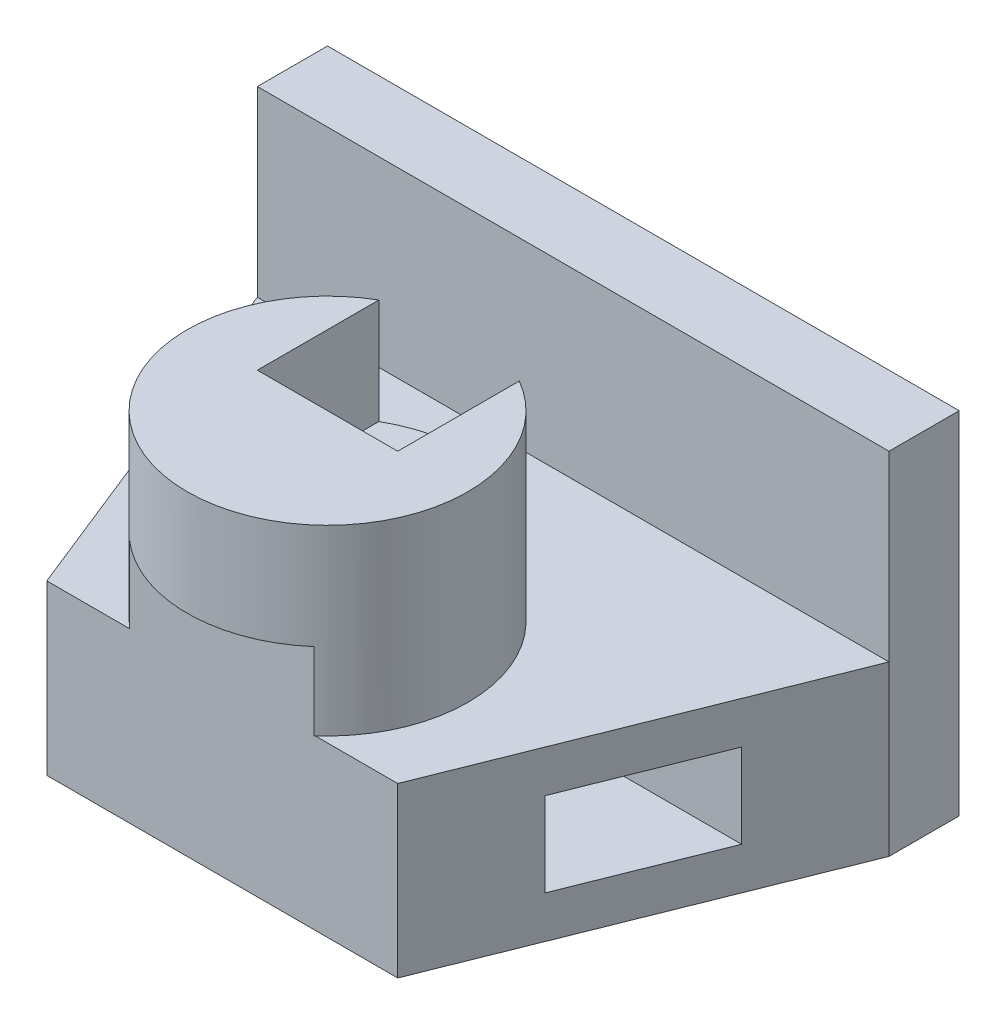
ISO-10303-21;
HEADER;
FILE_DESCRIPTION(('STEP AP214'),'2;1');
FILE_NAME('part.step','',(''),(''),'','','');
FILE_SCHEMA(('AUTOMOTIVE_DESIGN { 1 0 10303 214 1 1 1 1 }'));
ENDSEC;
DATA;
#1=APPLICATION_CONTEXT('core data for automotive mechanical design processes');
#2=APPLICATION_PROTOCOL_DEFINITION('international standard','automotive_design',2000,#1);
#3=PRODUCT_CONTEXT('',#1,'mechanical');
#4=PRODUCT('Part','Part','',(#3));
#5=PRODUCT_RELATED_PRODUCT_CATEGORY('part','',(#4));
#6=PRODUCT_DEFINITION_FORMATION('','',#4);
#7=PRODUCT_DEFINITION_CONTEXT('part definition',#1,'design');
#8=PRODUCT_DEFINITION('design','',#6,#7);
#9=PRODUCT_DEFINITION_SHAPE('','',#8);
#10=(LENGTH_UNIT() NAMED_UNIT(*) SI_UNIT(.MILLI.,.METRE.));
#11=(NAMED_UNIT(*) PLANE_ANGLE_UNIT() SI_UNIT($,.RADIAN.));
#12=(NAMED_UNIT(*) SI_UNIT($,.STERADIAN.) SOLID_ANGLE_UNIT());
#13=UNCERTAINTY_MEASURE_WITH_UNIT(LENGTH_MEASURE(1.E-05),#10,'distance_accuracy_value','');
#14=(GEOMETRIC_REPRESENTATION_CONTEXT(3) GLOBAL_UNCERTAINTY_ASSIGNED_CONTEXT((#13)) GLOBAL_UNIT_ASSIGNED_CONTEXT((#10,
#11,#12)) REPRESENTATION_CONTEXT('',''));
#15=CARTESIAN_POINT('',(0.,0.,0.));
#16=DIRECTION('',(0.,0.,1.));
#17=DIRECTION('',(1.,0.,0.));
#18=AXIS2_PLACEMENT_3D('',#15,#16,#17);
#19=CARTESIAN_POINT('',(45.,-25.,10.));
#20=DIRECTION('',(-1.,0.,0.));
#21=DIRECTION('',(0.,0.,1.));
#22=AXIS2_PLACEMENT_3D('',#19,#20,#21);
#23=PLANE('',#22);
#24=DIRECTION('',(0.,1.,0.));
#25=VECTOR('',#24,1.);
#26=CARTESIAN_POINT('',(45.,-25.,0.));
#27=LINE('',#26,#25);
#28=CARTESIAN_POINT('',(45.,-25.,0.));
#29=VERTEX_POINT('',#28);
#30=CARTESIAN_POINT('',(45.,25.,0.));
#31=VERTEX_POINT('',#30);
#32=EDGE_CURVE('E232',#29,#31,#27,.T.);
#33=ORIENTED_EDGE('',*,*,#32,.T.);
#34=DIRECTION('',(0.,0.,-1.));
#35=VECTOR('',#34,1.);
#36=CARTESIAN_POINT('',(45.,25.,10.));
#37=LINE('',#36,#35);
#38=CARTESIAN_POINT('',(45.,25.,10.));
#39=VERTEX_POINT('',#38);
#40=EDGE_CURVE('E205',#39,#31,#37,.T.);
#41=ORIENTED_EDGE('',*,*,#40,.F.);
#42=DIRECTION('',(0.,1.,0.));
#43=VECTOR('',#42,1.);
#44=CARTESIAN_POINT('',(45.,-25.,10.));
#45=LINE('',#44,#43);
#46=CARTESIAN_POINT('',(45.,-1.,10.));
#47=VERTEX_POINT('',#46);
#48=EDGE_CURVE('E225',#47,#39,#45,.T.);
#49=ORIENTED_EDGE('',*,*,#48,.F.);
#50=CARTESIAN_POINT('',(45.,-25.,10.));
#51=VERTEX_POINT('',#50);
#52=EDGE_CURVE('E243',#51,#47,#45,.T.);
#53=ORIENTED_EDGE('',*,*,#52,.F.);
#54=DIRECTION('',(0.,0.,-1.));
#55=VECTOR('',#54,1.);
#56=CARTESIAN_POINT('',(45.,-25.,10.));
#57=LINE('',#56,#55);
#58=EDGE_CURVE('E217',#51,#29,#57,.T.);
#59=ORIENTED_EDGE('',*,*,#58,.T.);
#60=EDGE_LOOP('',(#33,#41,#49,#53,#59));
#61=FACE_BOUND('',#60,.T.);
#62=ADVANCED_FACE('F39',(#61),#23,.F.);
#63=CARTESIAN_POINT('',(-45.,25.,10.));
#64=DIRECTION('',(0.,-1.,0.));
#65=DIRECTION('',(0.,0.,-1.));
#66=AXIS2_PLACEMENT_3D('',#63,#64,#65);
#67=PLANE('',#66);
#68=DIRECTION('',(-1.,0.,0.));
#69=VECTOR('',#68,1.);
#70=CARTESIAN_POINT('',(-45.,25.,0.));
#71=LINE('',#70,#69);
#72=CARTESIAN_POINT('',(-45.,25.,0.));
#73=VERTEX_POINT('',#72);
#74=EDGE_CURVE('E229',#31,#73,#71,.T.);
#75=ORIENTED_EDGE('',*,*,#74,.T.);
#76=DIRECTION('',(0.,0.,-1.));
#77=VECTOR('',#76,1.);
#78=CARTESIAN_POINT('',(-45.,25.,10.));
#79=LINE('',#78,#77);
#80=CARTESIAN_POINT('',(-45.,25.,10.));
#81=VERTEX_POINT('',#80);
#82=EDGE_CURVE('E209',#81,#73,#79,.T.);
#83=ORIENTED_EDGE('',*,*,#82,.F.);
#84=DIRECTION('',(-1.,0.,0.));
#85=VECTOR('',#84,1.);
#86=CARTESIAN_POINT('',(-45.,25.,10.));
#87=LINE('',#86,#85);
#88=EDGE_CURVE('E240',#39,#81,#87,.T.);
#89=ORIENTED_EDGE('',*,*,#88,.F.);
#90=ORIENTED_EDGE('',*,*,#40,.T.);
#91=EDGE_LOOP('',(#75,#83,#89,#90));
#92=FACE_BOUND('',#91,.T.);
#93=ADVANCED_FACE('F380',(#92),#67,.F.);
#94=CARTESIAN_POINT('',(-45.,-25.,10.));
#95=DIRECTION('',(1.,0.,0.));
#96=DIRECTION('',(0.,0.,-1.));
#97=AXIS2_PLACEMENT_3D('',#94,#95,#96);
#98=PLANE('',#97);
#99=DIRECTION('',(0.,-1.,0.));
#100=VECTOR('',#99,1.);
#101=CARTESIAN_POINT('',(-45.,-25.,0.));
#102=LINE('',#101,#100);
#103=CARTESIAN_POINT('',(-45.,-25.,0.));
#104=VERTEX_POINT('',#103);
#105=EDGE_CURVE('E226',#73,#104,#102,.T.);
#106=ORIENTED_EDGE('',*,*,#105,.T.);
#107=DIRECTION('',(0.,0.,-1.));
#108=VECTOR('',#107,1.);
#109=CARTESIAN_POINT('',(-45.,-25.,10.));
#110=LINE('',#109,#108);
#111=CARTESIAN_POINT('',(-45.,-25.,10.));
#112=VERTEX_POINT('',#111);
#113=EDGE_CURVE('E213',#112,#104,#110,.T.);
#114=ORIENTED_EDGE('',*,*,#113,.F.);
#115=DIRECTION('',(0.,-1.,0.));
#116=VECTOR('',#115,1.);
#117=CARTESIAN_POINT('',(-45.,-1.,10.));
#118=LINE('',#117,#116);
#119=CARTESIAN_POINT('',(-45.,-1.,10.));
#120=VERTEX_POINT('',#119);
#121=EDGE_CURVE('E236',#120,#112,#118,.T.);
#122=ORIENTED_EDGE('',*,*,#121,.F.);
#123=DIRECTION('',(0.,-1.,0.));
#124=VECTOR('',#123,1.);
#125=CARTESIAN_POINT('',(-45.,-25.,10.));
#126=LINE('',#125,#124);
#127=EDGE_CURVE('E221',#81,#120,#126,.T.);
#128=ORIENTED_EDGE('',*,*,#127,.F.);
#129=ORIENTED_EDGE('',*,*,#82,.T.);
#130=EDGE_LOOP('',(#106,#114,#122,#128,#129));
#131=FACE_BOUND('',#130,.T.);
#132=ADVANCED_FACE('F385',(#131),#98,.F.);
#133=CARTESIAN_POINT('',(-45.,-25.,10.));
#134=DIRECTION('',(0.,1.,0.));
#135=DIRECTION('',(0.,0.,1.));
#136=AXIS2_PLACEMENT_3D('',#133,#134,#135);
#137=PLANE('',#136);
#138=DIRECTION('',(1.,0.,0.));
#139=VECTOR('',#138,1.);
#140=CARTESIAN_POINT('',(-45.,-25.,0.));
#141=LINE('',#140,#139);
#142=EDGE_CURVE('E222',#104,#29,#141,.T.);
#143=ORIENTED_EDGE('',*,*,#142,.T.);
#144=ORIENTED_EDGE('',*,*,#58,.F.);
#145=DIRECTION('',(-0.371390676354103,0.,0.92847669088526));
#146=VECTOR('',#145,1.);
#147=CARTESIAN_POINT('',(25.,-25.,60.));
#148=LINE('',#147,#146);
#149=CARTESIAN_POINT('',(25.,-25.,60.));
#150=VERTEX_POINT('',#149);
#151=EDGE_CURVE('E265',#51,#150,#148,.T.);
#152=ORIENTED_EDGE('',*,*,#151,.T.);
#153=DIRECTION('',(-1.,0.,0.));
#154=VECTOR('',#153,1.);
#155=CARTESIAN_POINT('',(-25.,-25.,60.));
#156=LINE('',#155,#154);
#157=CARTESIAN_POINT('',(-25.,-25.,60.));
#158=VERTEX_POINT('',#157);
#159=EDGE_CURVE('E262',#150,#158,#156,.T.);
#160=ORIENTED_EDGE('',*,*,#159,.T.);
#161=DIRECTION('',(-0.371390676354104,0.,-0.928476690885259));
#162=VECTOR('',#161,1.);
#163=CARTESIAN_POINT('',(-45.,-25.,10.));
#164=LINE('',#163,#162);
#165=EDGE_CURVE('E257',#158,#112,#164,.T.);
#166=ORIENTED_EDGE('',*,*,#165,.T.);
#167=ORIENTED_EDGE('',*,*,#113,.T.);
#168=EDGE_LOOP('',(#143,#144,#152,#160,#166,#167));
#169=FACE_BOUND('',#168,.T.);
#170=ADVANCED_FACE('F429',(#169),#137,.F.);
#171=CARTESIAN_POINT('',(0.,0.,10.));
#172=DIRECTION('',(0.,0.,-1.));
#173=DIRECTION('',(-1.,0.,0.));
#174=AXIS2_PLACEMENT_3D('',#171,#172,#173);
#175=PLANE('',#174);
#176=ORIENTED_EDGE('',*,*,#127,.T.);
#177=DIRECTION('',(1.,0.,0.));
#178=VECTOR('',#177,1.);
#179=CARTESIAN_POINT('',(45.,-1.,10.));
#180=LINE('',#179,#178);
#181=EDGE_CURVE('E251',#120,#47,#180,.T.);
#182=ORIENTED_EDGE('',*,*,#181,.T.);
#183=ORIENTED_EDGE('',*,*,#48,.T.);
#184=ORIENTED_EDGE('',*,*,#88,.T.);
#185=EDGE_LOOP('',(#176,#182,#183,#184));
#186=FACE_BOUND('',#185,.T.);
#187=ADVANCED_FACE('F400',(#186),#175,.F.);
#188=CARTESIAN_POINT('',(0.,0.,0.));
#189=DIRECTION('',(0.,0.,-1.));
#190=DIRECTION('',(-1.,0.,0.));
#191=AXIS2_PLACEMENT_3D('',#188,#189,#190);
#192=PLANE('',#191);
#193=ORIENTED_EDGE('',*,*,#32,.F.);
#194=ORIENTED_EDGE('',*,*,#142,.F.);
#195=ORIENTED_EDGE('',*,*,#105,.F.);
#196=ORIENTED_EDGE('',*,*,#74,.F.);
#197=EDGE_LOOP('',(#193,#194,#195,#196));
#198=FACE_BOUND('',#197,.T.);
#199=ADVANCED_FACE('F394',(#198),#192,.T.);
#200=CARTESIAN_POINT('',(25.,-1.,60.));
#201=DIRECTION('',(0.928476690885259,0.,0.371390676354103));
#202=DIRECTION('',(0.371390676354103,0.,-0.92847669088526));
#203=AXIS2_PLACEMENT_3D('',#200,#201,#202);
#204=PLANE('',#203);
#205=DIRECTION('',(0.,-1.,0.));
#206=VECTOR('',#205,1.);
#207=CARTESIAN_POINT('',(31.,-1.,45.));
#208=LINE('',#207,#206);
#209=CARTESIAN_POINT('',(31.,-7.,45.));
#210=VERTEX_POINT('',#209);
#211=CARTESIAN_POINT('',(31.,-19.,45.));
#212=VERTEX_POINT('',#211);
#213=EDGE_CURVE('E177',#210,#212,#208,.T.);
#214=ORIENTED_EDGE('',*,*,#213,.F.);
#215=DIRECTION('',(-0.371390676354103,0.,0.92847669088526));
#216=VECTOR('',#215,1.);
#217=CARTESIAN_POINT('',(25.,-7.,60.));
#218=LINE('',#217,#216);
#219=CARTESIAN_POINT('',(39.,-7.,25.));
#220=VERTEX_POINT('',#219);
#221=EDGE_CURVE('E346',#220,#210,#218,.T.);
#222=ORIENTED_EDGE('',*,*,#221,.F.);
#223=DIRECTION('',(0.,1.,0.));
#224=VECTOR('',#223,1.);
#225=CARTESIAN_POINT('',(39.,-1.,25.));
#226=LINE('',#225,#224);
#227=CARTESIAN_POINT('',(39.,-19.,25.));
#228=VERTEX_POINT('',#227);
#229=EDGE_CURVE('E349',#228,#220,#226,.T.);
#230=ORIENTED_EDGE('',*,*,#229,.F.);
#231=DIRECTION('',(0.371390676354103,0.,-0.92847669088526));
#232=VECTOR('',#231,1.);
#233=CARTESIAN_POINT('',(25.,-19.,60.));
#234=LINE('',#233,#232);
#235=EDGE_CURVE('E352',#212,#228,#234,.T.);
#236=ORIENTED_EDGE('',*,*,#235,.F.);
#237=EDGE_LOOP('',(#214,#222,#230,#236));
#238=FACE_BOUND('',#237,.T.);
#239=ORIENTED_EDGE('',*,*,#151,.F.);
#240=ORIENTED_EDGE('',*,*,#52,.T.);
#241=DIRECTION('',(-0.371390676354103,0.,0.92847669088526));
#242=VECTOR('',#241,1.);
#243=CARTESIAN_POINT('',(25.,-1.,60.));
#244=LINE('',#243,#242);
#245=CARTESIAN_POINT('',(25.,-1.,60.));
#246=VERTEX_POINT('',#245);
#247=EDGE_CURVE('E261',#47,#246,#244,.T.);
#248=ORIENTED_EDGE('',*,*,#247,.T.);
#249=DIRECTION('',(0.,-1.,0.));
#250=VECTOR('',#249,1.);
#251=CARTESIAN_POINT('',(25.,-1.,60.));
#252=LINE('',#251,#250);
#253=EDGE_CURVE('E247',#246,#150,#252,.T.);
#254=ORIENTED_EDGE('',*,*,#253,.T.);
#255=EDGE_LOOP('',(#239,#240,#248,#254));
#256=FACE_BOUND('',#255,.T.);
#257=ADVANCED_FACE('F364',(#238,#256),#204,.T.);
#258=CARTESIAN_POINT('',(-45.,-1.,10.));
#259=DIRECTION('',(-0.928476690885259,0.,0.371390676354104));
#260=DIRECTION('',(0.371390676354104,0.,0.928476690885259));
#261=AXIS2_PLACEMENT_3D('',#258,#259,#260);
#262=PLANE('',#261);
#263=DIRECTION('',(0.,1.,0.));
#264=VECTOR('',#263,1.);
#265=CARTESIAN_POINT('',(-31.,-1.,45.));
#266=LINE('',#265,#264);
#267=CARTESIAN_POINT('',(-31.,-19.,45.));
#268=VERTEX_POINT('',#267);
#269=CARTESIAN_POINT('',(-31.,-7.,45.));
#270=VERTEX_POINT('',#269);
#271=EDGE_CURVE('E11',#268,#270,#266,.T.);
#272=ORIENTED_EDGE('',*,*,#271,.F.);
#273=DIRECTION('',(0.371390676354104,0.,0.928476690885259));
#274=VECTOR('',#273,1.);
#275=CARTESIAN_POINT('',(-45.,-19.,10.));
#276=LINE('',#275,#274);
#277=CARTESIAN_POINT('',(-39.,-19.,25.));
#278=VERTEX_POINT('',#277);
#279=EDGE_CURVE('E163',#278,#268,#276,.T.);
#280=ORIENTED_EDGE('',*,*,#279,.F.);
#281=DIRECTION('',(0.,-1.,0.));
#282=VECTOR('',#281,1.);
#283=CARTESIAN_POINT('',(-39.,-1.,25.));
#284=LINE('',#283,#282);
#285=CARTESIAN_POINT('',(-39.,-7.,25.));
#286=VERTEX_POINT('',#285);
#287=EDGE_CURVE('E169',#286,#278,#284,.T.);
#288=ORIENTED_EDGE('',*,*,#287,.F.);
#289=DIRECTION('',(-0.371390676354104,0.,-0.928476690885259));
#290=VECTOR('',#289,1.);
#291=CARTESIAN_POINT('',(-45.,-7.,10.));
#292=LINE('',#291,#290);
#293=EDGE_CURVE('E47',#270,#286,#292,.T.);
#294=ORIENTED_EDGE('',*,*,#293,.F.);
#295=EDGE_LOOP('',(#272,#280,#288,#294));
#296=FACE_BOUND('',#295,.T.);
#297=ORIENTED_EDGE('',*,*,#165,.F.);
#298=DIRECTION('',(0.,-1.,0.));
#299=VECTOR('',#298,1.);
#300=CARTESIAN_POINT('',(-25.,-1.,60.));
#301=LINE('',#300,#299);
#302=CARTESIAN_POINT('',(-25.,-1.,60.));
#303=VERTEX_POINT('',#302);
#304=EDGE_CURVE('E250',#303,#158,#301,.T.);
#305=ORIENTED_EDGE('',*,*,#304,.F.);
#306=DIRECTION('',(-0.371390676354104,0.,-0.928476690885259));
#307=VECTOR('',#306,1.);
#308=CARTESIAN_POINT('',(-45.,-1.,10.));
#309=LINE('',#308,#307);
#310=EDGE_CURVE('E273',#303,#120,#309,.T.);
#311=ORIENTED_EDGE('',*,*,#310,.T.);
#312=ORIENTED_EDGE('',*,*,#121,.T.);
#313=EDGE_LOOP('',(#297,#305,#311,#312));
#314=FACE_BOUND('',#313,.T.);
#315=ADVANCED_FACE('F182',(#296,#314),#262,.T.);
#316=CARTESIAN_POINT('',(-25.,-1.,60.));
#317=DIRECTION('',(0.,0.,1.));
#318=DIRECTION('',(1.,0.,0.));
#319=AXIS2_PLACEMENT_3D('',#316,#317,#318);
#320=PLANE('',#319);
#321=DIRECTION('',(-1.,0.,0.));
#322=VECTOR('',#321,1.);
#323=CARTESIAN_POINT('',(-25.,-1.,60.));
#324=LINE('',#323,#322);
#325=CARTESIAN_POINT('',(13.228756555323,-1.,60.));
#326=VERTEX_POINT('',#325);
#327=CARTESIAN_POINT('',(13.140446232809,-1.,60.));
#328=VERTEX_POINT('',#327);
#329=EDGE_CURVE('E280',#326,#328,#324,.T.);
#330=ORIENTED_EDGE('',*,*,#329,.T.);
#331=DIRECTION('',(0.,-1.,0.));
#332=VECTOR('',#331,1.);
#333=CARTESIAN_POINT('',(13.140446232809,10.,60.));
#334=LINE('',#333,#332);
#335=CARTESIAN_POINT('',(13.140446232809,10.,60.));
#336=VERTEX_POINT('',#335);
#337=EDGE_CURVE('E330',#336,#328,#334,.T.);
#338=ORIENTED_EDGE('',*,*,#337,.F.);
#339=DIRECTION('',(1.,0.,0.));
#340=VECTOR('',#339,1.);
#341=CARTESIAN_POINT('',(-13.2287565553229,10.,60.));
#342=LINE('',#341,#340);
#343=CARTESIAN_POINT('',(-13.2287565553229,10.,60.));
#344=VERTEX_POINT('',#343);
#345=EDGE_CURVE('E340',#344,#336,#342,.T.);
#346=ORIENTED_EDGE('',*,*,#345,.F.);
#347=DIRECTION('',(0.,-1.,0.));
#348=VECTOR('',#347,1.);
#349=CARTESIAN_POINT('',(-13.2287565553229,10.,60.));
#350=LINE('',#349,#348);
#351=CARTESIAN_POINT('',(-13.2287565553229,-1.,60.));
#352=VERTEX_POINT('',#351);
#353=EDGE_CURVE('E331',#344,#352,#350,.T.);
#354=ORIENTED_EDGE('',*,*,#353,.T.);
#355=EDGE_CURVE('E281',#352,#303,#324,.T.);
#356=ORIENTED_EDGE('',*,*,#355,.T.);
#357=ORIENTED_EDGE('',*,*,#304,.T.);
#358=ORIENTED_EDGE('',*,*,#159,.F.);
#359=ORIENTED_EDGE('',*,*,#253,.F.);
#360=EDGE_CURVE('E276',#246,#326,#324,.T.);
#361=ORIENTED_EDGE('',*,*,#360,.T.);
#362=EDGE_LOOP('',(#330,#338,#346,#354,#356,#357,#358,#359,#361));
#363=FACE_BOUND('',#362,.T.);
#364=ADVANCED_FACE('F421',(#363),#320,.T.);
#365=CARTESIAN_POINT('',(0.,-1.,0.));
#366=DIRECTION('',(0.,1.,0.));
#367=DIRECTION('',(0.,0.,1.));
#368=AXIS2_PLACEMENT_3D('',#365,#366,#367);
#369=PLANE('',#368);
#370=ORIENTED_EDGE('',*,*,#355,.F.);
#371=CARTESIAN_POINT('',(0.,-1.,45.));
#372=DIRECTION('',(0.,1.,0.));
#373=DIRECTION('',(0.,0.,1.));
#374=AXIS2_PLACEMENT_3D('',#371,#372,#373);
#375=CIRCLE('',#374,20.);
#376=EDGE_CURVE('E285',#326,#352,#375,.T.);
#377=ORIENTED_EDGE('',*,*,#376,.F.);
#378=ORIENTED_EDGE('',*,*,#360,.F.);
#379=ORIENTED_EDGE('',*,*,#247,.F.);
#380=ORIENTED_EDGE('',*,*,#181,.F.);
#381=ORIENTED_EDGE('',*,*,#310,.F.);
#382=EDGE_LOOP('',(#370,#377,#378,#379,#380,#381));
#383=FACE_BOUND('',#382,.T.);
#384=ADVANCED_FACE('F419',(#383),#369,.T.);
#385=CARTESIAN_POINT('',(0.,25.,45.));
#386=DIRECTION('',(0.,-1.,0.));
#387=DIRECTION('',(0.,0.,-1.));
#388=AXIS2_PLACEMENT_3D('',#385,#386,#387);
#389=CYLINDRICAL_SURFACE('',#388,20.);
#390=CARTESIAN_POINT('',(0.,10.,45.));
#391=DIRECTION('',(0.,-1.,0.));
#392=DIRECTION('',(0.,0.,-1.));
#393=AXIS2_PLACEMENT_3D('',#390,#391,#392);
#394=CIRCLE('',#393,20.);
#395=CARTESIAN_POINT('',(-10.,10.,27.6794919243113));
#396=VERTEX_POINT('',#395);
#397=CARTESIAN_POINT('',(9.99999999999999,10.,27.6794919243112));
#398=VERTEX_POINT('',#397);
#399=EDGE_CURVE('E198',#396,#398,#394,.T.);
#400=ORIENTED_EDGE('',*,*,#399,.T.);
#401=DIRECTION('',(0.,-1.,0.));
#402=VECTOR('',#401,1.);
#403=CARTESIAN_POINT('',(9.99999999999999,25.,27.6794919243112));
#404=LINE('',#403,#402);
#405=CARTESIAN_POINT('',(9.99999999999999,25.,27.6794919243112));
#406=VERTEX_POINT('',#405);
#407=EDGE_CURVE('E293',#398,#406,#404,.F.);
#408=ORIENTED_EDGE('',*,*,#407,.T.);
#409=CARTESIAN_POINT('',(0.,25.,45.));
#410=DIRECTION('',(0.,1.,0.));
#411=DIRECTION('',(0.,0.,1.));
#412=AXIS2_PLACEMENT_3D('',#409,#410,#411);
#413=CIRCLE('',#412,20.);
#414=CARTESIAN_POINT('',(-10.,25.,27.6794919243112));
#415=VERTEX_POINT('',#414);
#416=EDGE_CURVE('E269',#415,#406,#413,.T.);
#417=ORIENTED_EDGE('',*,*,#416,.F.);
#418=DIRECTION('',(0.,-1.,0.));
#419=VECTOR('',#418,1.);
#420=CARTESIAN_POINT('',(-10.,25.,27.6794919243113));
#421=LINE('',#420,#419);
#422=EDGE_CURVE('E297',#415,#396,#421,.T.);
#423=ORIENTED_EDGE('',*,*,#422,.T.);
#424=EDGE_LOOP('',(#400,#408,#417,#423));
#425=FACE_BOUND('',#424,.T.);
#426=CARTESIAN_POINT('',(0.,10.,45.));
#427=DIRECTION('',(0.,1.,0.));
#428=DIRECTION('',(0.,0.,1.));
#429=AXIS2_PLACEMENT_3D('',#426,#427,#428);
#430=CIRCLE('',#429,20.);
#431=CARTESIAN_POINT('',(13.140446232809,10.,60.0774226180291));
#432=VERTEX_POINT('',#431);
#433=EDGE_CURVE('E170',#344,#432,#430,.T.);
#434=ORIENTED_EDGE('',*,*,#433,.T.);
#435=DIRECTION('',(0.,-1.,0.));
#436=VECTOR('',#435,1.);
#437=CARTESIAN_POINT('',(13.140446232809,25.,60.0774226180291));
#438=LINE('',#437,#436);
#439=CARTESIAN_POINT('',(13.140446232809,-1.,60.0774226180291));
#440=VERTEX_POINT('',#439);
#441=EDGE_CURVE('E317',#432,#440,#438,.T.);
#442=ORIENTED_EDGE('',*,*,#441,.T.);
#443=EDGE_CURVE('E289',#440,#326,#375,.T.);
#444=ORIENTED_EDGE('',*,*,#443,.T.);
#445=ORIENTED_EDGE('',*,*,#376,.T.);
#446=ORIENTED_EDGE('',*,*,#353,.F.);
#447=EDGE_LOOP('',(#434,#442,#444,#445,#446));
#448=FACE_BOUND('',#447,.T.);
#449=ADVANCED_FACE('F410',(#425,#448),#389,.T.);
#450=CARTESIAN_POINT('',(0.,25.,45.));
#451=DIRECTION('',(0.,1.,0.));
#452=DIRECTION('',(0.,0.,1.));
#453=AXIS2_PLACEMENT_3D('',#450,#451,#452);
#454=PLANE('',#453);
#455=DIRECTION('',(0.,0.,-1.));
#456=VECTOR('',#455,1.);
#457=CARTESIAN_POINT('',(9.99999999999999,25.,45.));
#458=LINE('',#457,#456);
#459=CARTESIAN_POINT('',(9.99999999999999,25.,45.));
#460=VERTEX_POINT('',#459);
#461=EDGE_CURVE('E314',#460,#406,#458,.T.);
#462=ORIENTED_EDGE('',*,*,#461,.F.);
#463=DIRECTION('',(1.,0.,0.));
#464=VECTOR('',#463,1.);
#465=CARTESIAN_POINT('',(-10.,25.,45.));
#466=LINE('',#465,#464);
#467=CARTESIAN_POINT('',(-10.,25.,45.));
#468=VERTEX_POINT('',#467);
#469=EDGE_CURVE('E309',#468,#460,#466,.T.);
#470=ORIENTED_EDGE('',*,*,#469,.F.);
#471=DIRECTION('',(0.,0.,1.));
#472=VECTOR('',#471,1.);
#473=CARTESIAN_POINT('',(-10.,25.,45.));
#474=LINE('',#473,#472);
#475=EDGE_CURVE('E202',#415,#468,#474,.T.);
#476=ORIENTED_EDGE('',*,*,#475,.F.);
#477=ORIENTED_EDGE('',*,*,#416,.T.);
#478=EDGE_LOOP('',(#462,#470,#476,#477));
#479=FACE_BOUND('',#478,.T.);
#480=ADVANCED_FACE('F458',(#479),#454,.T.);
#481=CARTESIAN_POINT('',(0.,-1.,45.));
#482=DIRECTION('',(0.,1.,0.));
#483=DIRECTION('',(0.,0.,1.));
#484=AXIS2_PLACEMENT_3D('',#481,#482,#483);
#485=PLANE('',#484);
#486=ORIENTED_EDGE('',*,*,#443,.F.);
#487=DIRECTION('',(0.,0.,-1.));
#488=VECTOR('',#487,1.);
#489=CARTESIAN_POINT('',(13.140446232809,-1.,45.));
#490=LINE('',#489,#488);
#491=EDGE_CURVE('E194',#440,#328,#490,.T.);
#492=ORIENTED_EDGE('',*,*,#491,.T.);
#493=ORIENTED_EDGE('',*,*,#329,.F.);
#494=EDGE_LOOP('',(#486,#492,#493));
#495=FACE_BOUND('',#494,.T.);
#496=ADVANCED_FACE('F415',(#495),#485,.F.);
#497=CARTESIAN_POINT('',(0.,10.,0.));
#498=DIRECTION('',(0.,-1.,0.));
#499=DIRECTION('',(0.,0.,-1.));
#500=AXIS2_PLACEMENT_3D('',#497,#498,#499);
#501=PLANE('',#500);
#502=DIRECTION('',(0.,0.,1.));
#503=VECTOR('',#502,1.);
#504=CARTESIAN_POINT('',(-10.,10.,45.));
#505=LINE('',#504,#503);
#506=CARTESIAN_POINT('',(-10.,10.,45.));
#507=VERTEX_POINT('',#506);
#508=EDGE_CURVE('E321',#396,#507,#505,.T.);
#509=ORIENTED_EDGE('',*,*,#508,.T.);
#510=DIRECTION('',(1.,0.,0.));
#511=VECTOR('',#510,1.);
#512=CARTESIAN_POINT('',(-10.,10.,45.));
#513=LINE('',#512,#511);
#514=CARTESIAN_POINT('',(9.99999999999999,10.,45.));
#515=VERTEX_POINT('',#514);
#516=EDGE_CURVE('E306',#507,#515,#513,.T.);
#517=ORIENTED_EDGE('',*,*,#516,.T.);
#518=DIRECTION('',(0.,0.,-1.));
#519=VECTOR('',#518,1.);
#520=CARTESIAN_POINT('',(9.99999999999999,10.,45.));
#521=LINE('',#520,#519);
#522=EDGE_CURVE('E313',#515,#398,#521,.T.);
#523=ORIENTED_EDGE('',*,*,#522,.T.);
#524=ORIENTED_EDGE('',*,*,#399,.F.);
#525=EDGE_LOOP('',(#509,#517,#523,#524));
#526=FACE_BOUND('',#525,.T.);
#527=ADVANCED_FACE('F443',(#526),#501,.F.);
#528=CARTESIAN_POINT('',(9.99999999999999,10.,45.));
#529=DIRECTION('',(1.,0.,0.));
#530=DIRECTION('',(0.,0.,-1.));
#531=AXIS2_PLACEMENT_3D('',#528,#529,#530);
#532=PLANE('',#531);
#533=ORIENTED_EDGE('',*,*,#522,.F.);
#534=DIRECTION('',(0.,1.,0.));
#535=VECTOR('',#534,1.);
#536=CARTESIAN_POINT('',(9.99999999999999,10.,45.));
#537=LINE('',#536,#535);
#538=EDGE_CURVE('E301',#515,#460,#537,.T.);
#539=ORIENTED_EDGE('',*,*,#538,.T.);
#540=ORIENTED_EDGE('',*,*,#461,.T.);
#541=ORIENTED_EDGE('',*,*,#407,.F.);
#542=EDGE_LOOP('',(#533,#539,#540,#541));
#543=FACE_BOUND('',#542,.T.);
#544=ADVANCED_FACE('F446',(#543),#532,.F.);
#545=CARTESIAN_POINT('',(-10.,10.,45.));
#546=DIRECTION('',(-1.,0.,0.));
#547=DIRECTION('',(0.,0.,1.));
#548=AXIS2_PLACEMENT_3D('',#545,#546,#547);
#549=PLANE('',#548);
#550=ORIENTED_EDGE('',*,*,#475,.T.);
#551=DIRECTION('',(0.,1.,0.));
#552=VECTOR('',#551,1.);
#553=CARTESIAN_POINT('',(-10.,10.,45.));
#554=LINE('',#553,#552);
#555=EDGE_CURVE('E302',#507,#468,#554,.T.);
#556=ORIENTED_EDGE('',*,*,#555,.F.);
#557=ORIENTED_EDGE('',*,*,#508,.F.);
#558=ORIENTED_EDGE('',*,*,#422,.F.);
#559=EDGE_LOOP('',(#550,#556,#557,#558));
#560=FACE_BOUND('',#559,.T.);
#561=ADVANCED_FACE('F450',(#560),#549,.F.);
#562=CARTESIAN_POINT('',(-10.,10.,45.));
#563=DIRECTION('',(0.,0.,1.));
#564=DIRECTION('',(1.,0.,0.));
#565=AXIS2_PLACEMENT_3D('',#562,#563,#564);
#566=PLANE('',#565);
#567=ORIENTED_EDGE('',*,*,#469,.T.);
#568=ORIENTED_EDGE('',*,*,#538,.F.);
#569=ORIENTED_EDGE('',*,*,#516,.F.);
#570=ORIENTED_EDGE('',*,*,#555,.T.);
#571=EDGE_LOOP('',(#567,#568,#569,#570));
#572=FACE_BOUND('',#571,.T.);
#573=ADVANCED_FACE('F440',(#572),#566,.F.);
#574=CARTESIAN_POINT('',(0.,10.,0.));
#575=DIRECTION('',(0.,1.,0.));
#576=DIRECTION('',(0.,0.,1.));
#577=AXIS2_PLACEMENT_3D('',#574,#575,#576);
#578=PLANE('',#577);
#579=ORIENTED_EDGE('',*,*,#345,.T.);
#580=DIRECTION('',(0.,0.,1.));
#581=VECTOR('',#580,1.);
#582=CARTESIAN_POINT('',(13.140446232809,10.,60.));
#583=LINE('',#582,#581);
#584=EDGE_CURVE('E334',#336,#432,#583,.T.);
#585=ORIENTED_EDGE('',*,*,#584,.T.);
#586=ORIENTED_EDGE('',*,*,#433,.F.);
#587=EDGE_LOOP('',(#579,#585,#586));
#588=FACE_BOUND('',#587,.T.);
#589=ADVANCED_FACE('F432',(#588),#578,.F.);
#590=CARTESIAN_POINT('',(13.140446232809,10.,60.));
#591=DIRECTION('',(1.,0.,0.));
#592=DIRECTION('',(0.,0.,-1.));
#593=AXIS2_PLACEMENT_3D('',#590,#591,#592);
#594=PLANE('',#593);
#595=ORIENTED_EDGE('',*,*,#584,.F.);
#596=ORIENTED_EDGE('',*,*,#337,.T.);
#597=ORIENTED_EDGE('',*,*,#491,.F.);
#598=ORIENTED_EDGE('',*,*,#441,.F.);
#599=EDGE_LOOP('',(#595,#596,#597,#598));
#600=FACE_BOUND('',#599,.T.);
#601=ADVANCED_FACE('F377',(#600),#594,.F.);
#602=CARTESIAN_POINT('',(-45.,-7.,45.));
#603=DIRECTION('',(0.,0.,1.));
#604=DIRECTION('',(1.,0.,0.));
#605=AXIS2_PLACEMENT_3D('',#602,#603,#604);
#606=PLANE('',#605);
#607=ORIENTED_EDGE('',*,*,#213,.T.);
#608=DIRECTION('',(1.,0.,0.));
#609=VECTOR('',#608,1.);
#610=CARTESIAN_POINT('',(-45.,-19.,45.));
#611=LINE('',#610,#609);
#612=EDGE_CURVE('E54',#268,#212,#611,.T.);
#613=ORIENTED_EDGE('',*,*,#612,.F.);
#614=ORIENTED_EDGE('',*,*,#271,.T.);
#615=DIRECTION('',(1.,0.,0.));
#616=VECTOR('',#615,1.);
#617=CARTESIAN_POINT('',(-45.,-7.,45.));
#618=LINE('',#617,#616);
#619=EDGE_CURVE('E354',#270,#210,#618,.T.);
#620=ORIENTED_EDGE('',*,*,#619,.T.);
#621=EDGE_LOOP('',(#607,#613,#614,#620));
#622=FACE_BOUND('',#621,.T.);
#623=ADVANCED_FACE('F173',(#622),#606,.F.);
#624=CARTESIAN_POINT('',(-45.,-7.,45.));
#625=DIRECTION('',(0.,1.,0.));
#626=DIRECTION('',(0.,0.,1.));
#627=AXIS2_PLACEMENT_3D('',#624,#625,#626);
#628=PLANE('',#627);
#629=ORIENTED_EDGE('',*,*,#221,.T.);
#630=ORIENTED_EDGE('',*,*,#619,.F.);
#631=ORIENTED_EDGE('',*,*,#293,.T.);
#632=DIRECTION('',(1.,0.,0.));
#633=VECTOR('',#632,1.);
#634=CARTESIAN_POINT('',(-45.,-7.,25.));
#635=LINE('',#634,#633);
#636=EDGE_CURVE('E358',#286,#220,#635,.T.);
#637=ORIENTED_EDGE('',*,*,#636,.T.);
#638=EDGE_LOOP('',(#629,#630,#631,#637));
#639=FACE_BOUND('',#638,.T.);
#640=ADVANCED_FACE('F369',(#639),#628,.F.);
#641=CARTESIAN_POINT('',(-45.,-7.,25.));
#642=DIRECTION('',(0.,0.,-1.));
#643=DIRECTION('',(-1.,0.,0.));
#644=AXIS2_PLACEMENT_3D('',#641,#642,#643);
#645=PLANE('',#644);
#646=ORIENTED_EDGE('',*,*,#229,.T.);
#647=ORIENTED_EDGE('',*,*,#636,.F.);
#648=ORIENTED_EDGE('',*,*,#287,.T.);
#649=DIRECTION('',(1.,0.,0.));
#650=VECTOR('',#649,1.);
#651=CARTESIAN_POINT('',(-45.,-19.,25.));
#652=LINE('',#651,#650);
#653=EDGE_CURVE('E59',#278,#228,#652,.T.);
#654=ORIENTED_EDGE('',*,*,#653,.T.);
#655=EDGE_LOOP('',(#646,#647,#648,#654));
#656=FACE_BOUND('',#655,.T.);
#657=ADVANCED_FACE('F368',(#656),#645,.F.);
#658=CARTESIAN_POINT('',(-45.,-19.,45.));
#659=DIRECTION('',(0.,-1.,0.));
#660=DIRECTION('',(0.,0.,-1.));
#661=AXIS2_PLACEMENT_3D('',#658,#659,#660);
#662=PLANE('',#661);
#663=ORIENTED_EDGE('',*,*,#235,.T.);
#664=ORIENTED_EDGE('',*,*,#653,.F.);
#665=ORIENTED_EDGE('',*,*,#279,.T.);
#666=ORIENTED_EDGE('',*,*,#612,.T.);
#667=EDGE_LOOP('',(#663,#664,#665,#666));
#668=FACE_BOUND('',#667,.T.);
#669=ADVANCED_FACE('F164',(#668),#662,.F.);
#670=CLOSED_SHELL('',(#62,#93,#132,#170,#187,#199,#257,#315,#364,#384,#449,#480,#496,#527,#544,
#561,#573,#589,#601,#623,#640,#657,#669));
#671=MANIFOLD_SOLID_BREP('B2',#670);
#672=ADVANCED_BREP_SHAPE_REPRESENTATION('',(#18,#671),#14);
#673=SHAPE_DEFINITION_REPRESENTATION(#9,#672);
ENDSEC;
END-ISO-10303-21;
